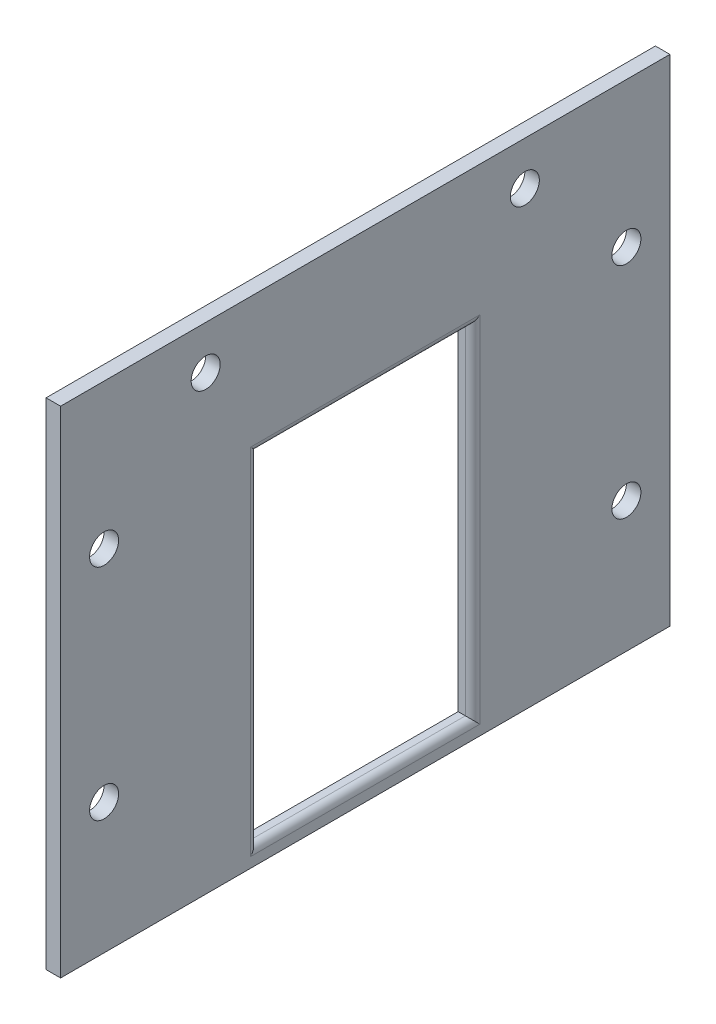
ISO-10303-21;
HEADER;
FILE_DESCRIPTION(('STEP AP214'),'2;1');
FILE_NAME('part.step','',(''),(''),'','','');
FILE_SCHEMA(('AUTOMOTIVE_DESIGN { 1 0 10303 214 1 1 1 1 }'));
ENDSEC;
DATA;
#1=APPLICATION_CONTEXT('core data for automotive mechanical design processes');
#2=APPLICATION_PROTOCOL_DEFINITION('international standard','automotive_design',2000,#1);
#3=PRODUCT_CONTEXT('',#1,'mechanical');
#4=PRODUCT('Part','Part','',(#3));
#5=PRODUCT_RELATED_PRODUCT_CATEGORY('part','',(#4));
#6=PRODUCT_DEFINITION_FORMATION('','',#4);
#7=PRODUCT_DEFINITION_CONTEXT('part definition',#1,'design');
#8=PRODUCT_DEFINITION('design','',#6,#7);
#9=PRODUCT_DEFINITION_SHAPE('','',#8);
#10=(LENGTH_UNIT() NAMED_UNIT(*) SI_UNIT(.MILLI.,.METRE.));
#11=(NAMED_UNIT(*) PLANE_ANGLE_UNIT() SI_UNIT($,.RADIAN.));
#12=(NAMED_UNIT(*) SI_UNIT($,.STERADIAN.) SOLID_ANGLE_UNIT());
#13=UNCERTAINTY_MEASURE_WITH_UNIT(LENGTH_MEASURE(1.E-05),#10,'distance_accuracy_value','');
#14=(GEOMETRIC_REPRESENTATION_CONTEXT(3) GLOBAL_UNCERTAINTY_ASSIGNED_CONTEXT((#13)) GLOBAL_UNIT_ASSIGNED_CONTEXT((#10,
#11,#12)) REPRESENTATION_CONTEXT('',''));
#15=CARTESIAN_POINT('',(0.,0.,0.));
#16=DIRECTION('',(0.,0.,1.));
#17=DIRECTION('',(1.,0.,0.));
#18=AXIS2_PLACEMENT_3D('',#15,#16,#17);
#19=CARTESIAN_POINT('',(-3.175,0.,0.));
#20=DIRECTION('',(-1.,0.,0.));
#21=DIRECTION('',(0.,0.,1.));
#22=AXIS2_PLACEMENT_3D('',#19,#20,#21);
#23=PLANE('',#22);
#24=CARTESIAN_POINT('',(-3.17500000000003,-60.325,-57.15));
#25=DIRECTION('',(1.,0.,0.));
#26=DIRECTION('',(0.,0.,1.));
#27=AXIS2_PLACEMENT_3D('',#24,#25,#26);
#28=CIRCLE('',#27,3.17499999999999);
#29=CARTESIAN_POINT('',(-3.17500000000003,-60.325,-53.975));
#30=VERTEX_POINT('',#29);
#31=EDGE_CURVE('E525',#30,#30,#28,.T.);
#32=ORIENTED_EDGE('',*,*,#31,.T.);
#33=EDGE_LOOP('',(#32));
#34=FACE_BOUND('',#33,.T.);
#35=CARTESIAN_POINT('',(-3.17500000000003,-12.275000088,-57.15));
#36=DIRECTION('',(1.,0.,0.));
#37=DIRECTION('',(0.,0.,1.));
#38=AXIS2_PLACEMENT_3D('',#35,#36,#37);
#39=CIRCLE('',#38,3.17499999999999);
#40=CARTESIAN_POINT('',(-3.17500000000003,-12.275000088,-53.975));
#41=VERTEX_POINT('',#40);
#42=EDGE_CURVE('E530',#41,#41,#39,.T.);
#43=ORIENTED_EDGE('',*,*,#42,.T.);
#44=EDGE_LOOP('',(#43));
#45=FACE_BOUND('',#44,.T.);
#46=CARTESIAN_POINT('',(-3.17500000000003,9.94999991199999,-34.925));
#47=DIRECTION('',(1.,0.,0.));
#48=DIRECTION('',(0.,0.,1.));
#49=AXIS2_PLACEMENT_3D('',#46,#47,#48);
#50=CIRCLE('',#49,3.175);
#51=CARTESIAN_POINT('',(-3.17500000000003,9.94999991199999,-31.75));
#52=VERTEX_POINT('',#51);
#53=EDGE_CURVE('E570',#52,#52,#50,.T.);
#54=ORIENTED_EDGE('',*,*,#53,.T.);
#55=EDGE_LOOP('',(#54));
#56=FACE_BOUND('',#55,.T.);
#57=CARTESIAN_POINT('',(-3.17500000000003,9.94999991199998,34.925));
#58=DIRECTION('',(1.,0.,0.));
#59=DIRECTION('',(0.,0.,-1.));
#60=AXIS2_PLACEMENT_3D('',#57,#58,#59);
#61=CIRCLE('',#60,3.175);
#62=CARTESIAN_POINT('',(-3.17500000000003,9.94999991199998,31.75));
#63=VERTEX_POINT('',#62);
#64=EDGE_CURVE('E562',#63,#63,#61,.T.);
#65=ORIENTED_EDGE('',*,*,#64,.T.);
#66=EDGE_LOOP('',(#65));
#67=FACE_BOUND('',#66,.T.);
#68=CARTESIAN_POINT('',(-3.17500000000003,-12.275000088,57.15));
#69=DIRECTION('',(1.,0.,0.));
#70=DIRECTION('',(0.,0.,-1.));
#71=AXIS2_PLACEMENT_3D('',#68,#69,#70);
#72=CIRCLE('',#71,3.175);
#73=CARTESIAN_POINT('',(-3.17500000000003,-12.275000088,53.975));
#74=VERTEX_POINT('',#73);
#75=EDGE_CURVE('E550',#74,#74,#72,.T.);
#76=ORIENTED_EDGE('',*,*,#75,.T.);
#77=EDGE_LOOP('',(#76));
#78=FACE_BOUND('',#77,.T.);
#79=CARTESIAN_POINT('',(-3.17500000000003,-60.325,57.15));
#80=DIRECTION('',(1.,0.,0.));
#81=DIRECTION('',(0.,0.,-1.));
#82=AXIS2_PLACEMENT_3D('',#79,#80,#81);
#83=CIRCLE('',#82,3.175);
#84=CARTESIAN_POINT('',(-3.17500000000003,-60.325,53.975));
#85=VERTEX_POINT('',#84);
#86=EDGE_CURVE('E237',#85,#85,#83,.T.);
#87=ORIENTED_EDGE('',*,*,#86,.T.);
#88=EDGE_LOOP('',(#87));
#89=FACE_BOUND('',#88,.T.);
#90=DIRECTION('',(0.,0.,-1.));
#91=VECTOR('',#90,1.);
#92=CARTESIAN_POINT('',(-3.175,19.474999912,63.5));
#93=LINE('',#92,#91);
#94=CARTESIAN_POINT('',(-3.17500000000003,19.474999912,66.675));
#95=VERTEX_POINT('',#94);
#96=CARTESIAN_POINT('',(-3.175,19.474999912,-66.675));
#97=VERTEX_POINT('',#96);
#98=EDGE_CURVE('E200',#95,#97,#93,.T.);
#99=ORIENTED_EDGE('',*,*,#98,.T.);
#100=DIRECTION('',(0.,1.,0.));
#101=VECTOR('',#100,1.);
#102=CARTESIAN_POINT('',(-3.175,-88.9,-66.675));
#103=LINE('',#102,#101);
#104=CARTESIAN_POINT('',(-3.17500000000003,-88.9,-66.675));
#105=VERTEX_POINT('',#104);
#106=EDGE_CURVE('E173',#105,#97,#103,.T.);
#107=ORIENTED_EDGE('',*,*,#106,.F.);
#108=DIRECTION('',(0.,0.,-1.));
#109=VECTOR('',#108,1.);
#110=CARTESIAN_POINT('',(-3.175,-88.9,63.5));
#111=LINE('',#110,#109);
#112=CARTESIAN_POINT('',(-3.175,-88.9,66.675));
#113=VERTEX_POINT('',#112);
#114=EDGE_CURVE('E206',#113,#105,#111,.T.);
#115=ORIENTED_EDGE('',*,*,#114,.F.);
#116=DIRECTION('',(0.,-1.,0.));
#117=VECTOR('',#116,1.);
#118=CARTESIAN_POINT('',(-3.175,19.474999912,66.675));
#119=LINE('',#118,#117);
#120=EDGE_CURVE('E188',#95,#113,#119,.T.);
#121=ORIENTED_EDGE('',*,*,#120,.F.);
#122=EDGE_LOOP('',(#99,#107,#115,#121));
#123=FACE_BOUND('',#122,.T.);
#124=DIRECTION('',(0.,1.,0.));
#125=VECTOR('',#124,1.);
#126=CARTESIAN_POINT('',(-3.17500000000003,0.,-23.495));
#127=LINE('',#126,#125);
#128=CARTESIAN_POINT('',(-3.17500000000003,-85.09,-23.495));
#129=VERTEX_POINT('',#128);
#130=CARTESIAN_POINT('',(-3.17500000000003,-10.668,-23.495));
#131=VERTEX_POINT('',#130);
#132=EDGE_CURVE('E141',#129,#131,#127,.T.);
#133=ORIENTED_EDGE('',*,*,#132,.T.);
#134=DIRECTION('',(0.,0.,-1.));
#135=VECTOR('',#134,1.);
#136=CARTESIAN_POINT('',(-3.17500000000003,-10.668,0.));
#137=LINE('',#136,#135);
#138=CARTESIAN_POINT('',(-3.17500000000003,-10.668,23.495));
#139=VERTEX_POINT('',#138);
#140=EDGE_CURVE('E136',#139,#131,#137,.T.);
#141=ORIENTED_EDGE('',*,*,#140,.F.);
#142=DIRECTION('',(0.,1.,0.));
#143=VECTOR('',#142,1.);
#144=CARTESIAN_POINT('',(-3.17500000000003,0.,23.495));
#145=LINE('',#144,#143);
#146=CARTESIAN_POINT('',(-3.175,-85.09,23.495));
#147=VERTEX_POINT('',#146);
#148=EDGE_CURVE('E126',#147,#139,#145,.T.);
#149=ORIENTED_EDGE('',*,*,#148,.F.);
#150=DIRECTION('',(0.,0.,1.));
#151=VECTOR('',#150,1.);
#152=CARTESIAN_POINT('',(-3.17500000000003,-85.09,0.));
#153=LINE('',#152,#151);
#154=EDGE_CURVE('E135',#129,#147,#153,.T.);
#155=ORIENTED_EDGE('',*,*,#154,.F.);
#156=EDGE_LOOP('',(#133,#141,#149,#155));
#157=FACE_BOUND('',#156,.T.);
#158=ADVANCED_FACE('F49',(#34,#45,#56,#67,#78,#89,#123,#157),#23,.T.);
#159=CARTESIAN_POINT('',(0.,0.,0.));
#160=DIRECTION('',(-1.,0.,0.));
#161=DIRECTION('',(0.,0.,1.));
#162=AXIS2_PLACEMENT_3D('',#159,#160,#161);
#163=PLANE('',#162);
#164=CARTESIAN_POINT('',(0.,-60.325,-57.15));
#165=DIRECTION('',(1.,0.,0.));
#166=DIRECTION('',(0.,0.,1.));
#167=AXIS2_PLACEMENT_3D('',#164,#165,#166);
#168=CIRCLE('',#167,3.17499999999999);
#169=CARTESIAN_POINT('',(0.,-60.325,-53.975));
#170=VERTEX_POINT('',#169);
#171=EDGE_CURVE('E528',#170,#170,#168,.T.);
#172=ORIENTED_EDGE('',*,*,#171,.F.);
#173=EDGE_LOOP('',(#172));
#174=FACE_BOUND('',#173,.T.);
#175=CARTESIAN_POINT('',(0.,-12.275000088,-57.15));
#176=DIRECTION('',(1.,0.,0.));
#177=DIRECTION('',(0.,0.,1.));
#178=AXIS2_PLACEMENT_3D('',#175,#176,#177);
#179=CIRCLE('',#178,3.17499999999999);
#180=CARTESIAN_POINT('',(0.,-12.275000088,-53.975));
#181=VERTEX_POINT('',#180);
#182=EDGE_CURVE('E535',#181,#181,#179,.T.);
#183=ORIENTED_EDGE('',*,*,#182,.F.);
#184=EDGE_LOOP('',(#183));
#185=FACE_BOUND('',#184,.T.);
#186=CARTESIAN_POINT('',(0.,9.94999991199999,-34.925));
#187=DIRECTION('',(1.,0.,0.));
#188=DIRECTION('',(0.,0.,1.));
#189=AXIS2_PLACEMENT_3D('',#186,#187,#188);
#190=CIRCLE('',#189,3.175);
#191=CARTESIAN_POINT('',(0.,9.94999991199999,-31.75));
#192=VERTEX_POINT('',#191);
#193=EDGE_CURVE('E566',#192,#192,#190,.T.);
#194=ORIENTED_EDGE('',*,*,#193,.F.);
#195=EDGE_LOOP('',(#194));
#196=FACE_BOUND('',#195,.T.);
#197=CARTESIAN_POINT('',(0.,9.94999991199998,34.925));
#198=DIRECTION('',(1.,0.,0.));
#199=DIRECTION('',(0.,0.,-1.));
#200=AXIS2_PLACEMENT_3D('',#197,#198,#199);
#201=CIRCLE('',#200,3.175);
#202=CARTESIAN_POINT('',(0.,9.94999991199998,31.75));
#203=VERTEX_POINT('',#202);
#204=EDGE_CURVE('E556',#203,#203,#201,.T.);
#205=ORIENTED_EDGE('',*,*,#204,.F.);
#206=EDGE_LOOP('',(#205));
#207=FACE_BOUND('',#206,.T.);
#208=CARTESIAN_POINT('',(0.,-12.275000088,57.15));
#209=DIRECTION('',(1.,0.,0.));
#210=DIRECTION('',(0.,0.,-1.));
#211=AXIS2_PLACEMENT_3D('',#208,#209,#210);
#212=CIRCLE('',#211,3.175);
#213=CARTESIAN_POINT('',(0.,-12.275000088,53.975));
#214=VERTEX_POINT('',#213);
#215=EDGE_CURVE('E545',#214,#214,#212,.T.);
#216=ORIENTED_EDGE('',*,*,#215,.F.);
#217=EDGE_LOOP('',(#216));
#218=FACE_BOUND('',#217,.T.);
#219=CARTESIAN_POINT('',(0.,-60.325,57.15));
#220=DIRECTION('',(1.,0.,0.));
#221=DIRECTION('',(0.,0.,-1.));
#222=AXIS2_PLACEMENT_3D('',#219,#220,#221);
#223=CIRCLE('',#222,3.175);
#224=CARTESIAN_POINT('',(0.,-60.325,53.975));
#225=VERTEX_POINT('',#224);
#226=EDGE_CURVE('E151',#225,#225,#223,.T.);
#227=ORIENTED_EDGE('',*,*,#226,.F.);
#228=EDGE_LOOP('',(#227));
#229=FACE_BOUND('',#228,.T.);
#230=DIRECTION('',(0.,0.,-1.));
#231=VECTOR('',#230,1.);
#232=CARTESIAN_POINT('',(0.,-9.08050000000001,-23.495));
#233=LINE('',#232,#231);
#234=CARTESIAN_POINT('',(0.,-9.08050000000001,25.0825));
#235=VERTEX_POINT('',#234);
#236=CARTESIAN_POINT('',(0.,-9.08050000000001,-25.0825));
#237=VERTEX_POINT('',#236);
#238=EDGE_CURVE('E218',#235,#237,#233,.T.);
#239=ORIENTED_EDGE('',*,*,#238,.T.);
#240=DIRECTION('',(0.,1.,0.));
#241=VECTOR('',#240,1.);
#242=CARTESIAN_POINT('',(0.,0.,-25.0825));
#243=LINE('',#242,#241);
#244=CARTESIAN_POINT('',(0.,-86.6775,-25.0825));
#245=VERTEX_POINT('',#244);
#246=EDGE_CURVE('E224',#237,#245,#243,.F.);
#247=ORIENTED_EDGE('',*,*,#246,.T.);
#248=DIRECTION('',(0.,0.,1.));
#249=VECTOR('',#248,1.);
#250=CARTESIAN_POINT('',(0.,-86.6775,23.495));
#251=LINE('',#250,#249);
#252=CARTESIAN_POINT('',(0.,-86.6775,25.0825));
#253=VERTEX_POINT('',#252);
#254=EDGE_CURVE('E221',#245,#253,#251,.T.);
#255=ORIENTED_EDGE('',*,*,#254,.T.);
#256=DIRECTION('',(0.,1.,0.));
#257=VECTOR('',#256,1.);
#258=CARTESIAN_POINT('',(0.,-10.668,25.0825));
#259=LINE('',#258,#257);
#260=EDGE_CURVE('E215',#253,#235,#259,.T.);
#261=ORIENTED_EDGE('',*,*,#260,.T.);
#262=EDGE_LOOP('',(#239,#247,#255,#261));
#263=FACE_BOUND('',#262,.T.);
#264=DIRECTION('',(0.,0.,-1.));
#265=VECTOR('',#264,1.);
#266=CARTESIAN_POINT('',(0.,-88.9,63.5));
#267=LINE('',#266,#265);
#268=CARTESIAN_POINT('',(0.,-88.9,66.675));
#269=VERTEX_POINT('',#268);
#270=CARTESIAN_POINT('',(0.,-88.9,-66.675));
#271=VERTEX_POINT('',#270);
#272=EDGE_CURVE('E203',#269,#271,#267,.T.);
#273=ORIENTED_EDGE('',*,*,#272,.T.);
#274=DIRECTION('',(0.,1.,0.));
#275=VECTOR('',#274,1.);
#276=CARTESIAN_POINT('',(0.,-88.9,-66.675));
#277=LINE('',#276,#275);
#278=CARTESIAN_POINT('',(0.,19.474999912,-66.675));
#279=VERTEX_POINT('',#278);
#280=EDGE_CURVE('E172',#271,#279,#277,.T.);
#281=ORIENTED_EDGE('',*,*,#280,.T.);
#282=DIRECTION('',(0.,0.,-1.));
#283=VECTOR('',#282,1.);
#284=CARTESIAN_POINT('',(0.,19.474999912,63.5));
#285=LINE('',#284,#283);
#286=CARTESIAN_POINT('',(0.,19.474999912,66.675));
#287=VERTEX_POINT('',#286);
#288=EDGE_CURVE('E196',#287,#279,#285,.T.);
#289=ORIENTED_EDGE('',*,*,#288,.F.);
#290=DIRECTION('',(0.,-1.,0.));
#291=VECTOR('',#290,1.);
#292=CARTESIAN_POINT('',(0.,19.474999912,66.675));
#293=LINE('',#292,#291);
#294=EDGE_CURVE('E183',#287,#269,#293,.T.);
#295=ORIENTED_EDGE('',*,*,#294,.T.);
#296=EDGE_LOOP('',(#273,#281,#289,#295));
#297=FACE_BOUND('',#296,.T.);
#298=ADVANCED_FACE('F263',(#174,#185,#196,#207,#218,#229,#263,#297),#163,.F.);
#299=CARTESIAN_POINT('',(-3.175,-88.9,63.5));
#300=DIRECTION('',(0.,-1.,0.));
#301=DIRECTION('',(0.,0.,-1.));
#302=AXIS2_PLACEMENT_3D('',#299,#300,#301);
#303=PLANE('',#302);
#304=ORIENTED_EDGE('',*,*,#272,.F.);
#305=DIRECTION('',(1.,0.,0.));
#306=VECTOR('',#305,1.);
#307=CARTESIAN_POINT('',(-111.596498010893,-88.9,66.675));
#308=LINE('',#307,#306);
#309=EDGE_CURVE('E192',#113,#269,#308,.T.);
#310=ORIENTED_EDGE('',*,*,#309,.F.);
#311=ORIENTED_EDGE('',*,*,#114,.T.);
#312=DIRECTION('',(1.,0.,0.));
#313=VECTOR('',#312,1.);
#314=CARTESIAN_POINT('',(-111.596498010893,-88.9,-66.675));
#315=LINE('',#314,#313);
#316=EDGE_CURVE('E168',#105,#271,#315,.T.);
#317=ORIENTED_EDGE('',*,*,#316,.T.);
#318=EDGE_LOOP('',(#304,#310,#311,#317));
#319=FACE_BOUND('',#318,.T.);
#320=ADVANCED_FACE('F266',(#319),#303,.T.);
#321=CARTESIAN_POINT('',(-3.175,19.474999912,63.5));
#322=DIRECTION('',(0.,-1.,0.));
#323=DIRECTION('',(0.,0.,-1.));
#324=AXIS2_PLACEMENT_3D('',#321,#322,#323);
#325=PLANE('',#324);
#326=ORIENTED_EDGE('',*,*,#288,.T.);
#327=DIRECTION('',(1.,0.,0.));
#328=VECTOR('',#327,1.);
#329=CARTESIAN_POINT('',(-111.596498010893,19.474999912,-66.675));
#330=LINE('',#329,#328);
#331=EDGE_CURVE('E161',#97,#279,#330,.T.);
#332=ORIENTED_EDGE('',*,*,#331,.F.);
#333=ORIENTED_EDGE('',*,*,#98,.F.);
#334=DIRECTION('',(1.,0.,0.));
#335=VECTOR('',#334,1.);
#336=CARTESIAN_POINT('',(-111.596498010893,19.474999912,66.675));
#337=LINE('',#336,#335);
#338=EDGE_CURVE('E187',#95,#287,#337,.T.);
#339=ORIENTED_EDGE('',*,*,#338,.T.);
#340=EDGE_LOOP('',(#326,#332,#333,#339));
#341=FACE_BOUND('',#340,.T.);
#342=ADVANCED_FACE('F279',(#341),#325,.F.);
#343=CARTESIAN_POINT('',(-111.596498010893,19.474999912,66.675));
#344=DIRECTION('',(0.,0.,1.));
#345=DIRECTION('',(0.,-1.,0.));
#346=AXIS2_PLACEMENT_3D('',#343,#344,#345);
#347=PLANE('',#346);
#348=ORIENTED_EDGE('',*,*,#338,.F.);
#349=ORIENTED_EDGE('',*,*,#120,.T.);
#350=ORIENTED_EDGE('',*,*,#309,.T.);
#351=ORIENTED_EDGE('',*,*,#294,.F.);
#352=EDGE_LOOP('',(#348,#349,#350,#351));
#353=FACE_BOUND('',#352,.T.);
#354=ADVANCED_FACE('F283',(#353),#347,.T.);
#355=CARTESIAN_POINT('',(-111.596498010893,-88.9,-66.675));
#356=DIRECTION('',(0.,0.,-1.));
#357=DIRECTION('',(-1.,0.,0.));
#358=AXIS2_PLACEMENT_3D('',#355,#356,#357);
#359=PLANE('',#358);
#360=ORIENTED_EDGE('',*,*,#316,.F.);
#361=ORIENTED_EDGE('',*,*,#106,.T.);
#362=ORIENTED_EDGE('',*,*,#331,.T.);
#363=ORIENTED_EDGE('',*,*,#280,.F.);
#364=EDGE_LOOP('',(#360,#361,#362,#363));
#365=FACE_BOUND('',#364,.T.);
#366=ADVANCED_FACE('F276',(#365),#359,.T.);
#367=CARTESIAN_POINT('',(-3.17500000000003,-10.668,0.));
#368=DIRECTION('',(0.,-1.,0.));
#369=DIRECTION('',(0.,0.,-1.));
#370=AXIS2_PLACEMENT_3D('',#367,#368,#369);
#371=PLANE('',#370);
#372=DIRECTION('',(1.,0.,0.));
#373=VECTOR('',#372,1.);
#374=CARTESIAN_POINT('',(-3.17500000000003,-10.668,-23.495));
#375=LINE('',#374,#373);
#376=CARTESIAN_POINT('',(-1.5875,-10.668,-23.495));
#377=VERTEX_POINT('',#376);
#378=EDGE_CURVE('E158',#131,#377,#375,.T.);
#379=ORIENTED_EDGE('',*,*,#378,.T.);
#380=DIRECTION('',(0.,0.,-1.));
#381=VECTOR('',#380,1.);
#382=CARTESIAN_POINT('',(-1.5875,-10.668,23.495));
#383=LINE('',#382,#381);
#384=CARTESIAN_POINT('',(-1.5875,-10.668,23.495));
#385=VERTEX_POINT('',#384);
#386=EDGE_CURVE('E59',#377,#385,#383,.F.);
#387=ORIENTED_EDGE('',*,*,#386,.T.);
#388=DIRECTION('',(1.,0.,0.));
#389=VECTOR('',#388,1.);
#390=CARTESIAN_POINT('',(-3.17500000000003,-10.668,23.495));
#391=LINE('',#390,#389);
#392=EDGE_CURVE('E128',#139,#385,#391,.T.);
#393=ORIENTED_EDGE('',*,*,#392,.F.);
#394=ORIENTED_EDGE('',*,*,#140,.T.);
#395=EDGE_LOOP('',(#379,#387,#393,#394));
#396=FACE_BOUND('',#395,.T.);
#397=ADVANCED_FACE('F138',(#396),#371,.T.);
#398=CARTESIAN_POINT('',(-3.17500000000003,0.,-23.495));
#399=DIRECTION('',(0.,0.,-1.));
#400=DIRECTION('',(-1.,0.,0.));
#401=AXIS2_PLACEMENT_3D('',#398,#399,#400);
#402=PLANE('',#401);
#403=DIRECTION('',(1.,0.,0.));
#404=VECTOR('',#403,1.);
#405=CARTESIAN_POINT('',(-3.17500000000003,-85.09,-23.495));
#406=LINE('',#405,#404);
#407=CARTESIAN_POINT('',(-1.5875,-85.09,-23.495));
#408=VERTEX_POINT('',#407);
#409=EDGE_CURVE('E162',#129,#408,#406,.T.);
#410=ORIENTED_EDGE('',*,*,#409,.T.);
#411=DIRECTION('',(0.,1.,0.));
#412=VECTOR('',#411,1.);
#413=CARTESIAN_POINT('',(-1.5875,0.,-23.495));
#414=LINE('',#413,#412);
#415=EDGE_CURVE('E209',#408,#377,#414,.T.);
#416=ORIENTED_EDGE('',*,*,#415,.T.);
#417=ORIENTED_EDGE('',*,*,#378,.F.);
#418=ORIENTED_EDGE('',*,*,#132,.F.);
#419=EDGE_LOOP('',(#410,#416,#417,#418));
#420=FACE_BOUND('',#419,.T.);
#421=ADVANCED_FACE('F258',(#420),#402,.F.);
#422=CARTESIAN_POINT('',(-3.17500000000003,-85.09,0.));
#423=DIRECTION('',(0.,1.,0.));
#424=DIRECTION('',(0.,0.,1.));
#425=AXIS2_PLACEMENT_3D('',#422,#423,#424);
#426=PLANE('',#425);
#427=DIRECTION('',(1.,0.,0.));
#428=VECTOR('',#427,1.);
#429=CARTESIAN_POINT('',(-3.17500000000003,-85.09,23.495));
#430=LINE('',#429,#428);
#431=CARTESIAN_POINT('',(-1.5875,-85.09,23.495));
#432=VERTEX_POINT('',#431);
#433=EDGE_CURVE('E129',#147,#432,#430,.T.);
#434=ORIENTED_EDGE('',*,*,#433,.T.);
#435=DIRECTION('',(0.,0.,1.));
#436=VECTOR('',#435,1.);
#437=CARTESIAN_POINT('',(-1.5875,-85.09,-23.495));
#438=LINE('',#437,#436);
#439=EDGE_CURVE('E228',#432,#408,#438,.F.);
#440=ORIENTED_EDGE('',*,*,#439,.T.);
#441=ORIENTED_EDGE('',*,*,#409,.F.);
#442=ORIENTED_EDGE('',*,*,#154,.T.);
#443=EDGE_LOOP('',(#434,#440,#441,#442));
#444=FACE_BOUND('',#443,.T.);
#445=ADVANCED_FACE('F256',(#444),#426,.T.);
#446=CARTESIAN_POINT('',(-3.17500000000003,0.,23.495));
#447=DIRECTION('',(0.,0.,-1.));
#448=DIRECTION('',(-1.,0.,0.));
#449=AXIS2_PLACEMENT_3D('',#446,#447,#448);
#450=PLANE('',#449);
#451=ORIENTED_EDGE('',*,*,#392,.T.);
#452=DIRECTION('',(0.,1.,0.));
#453=VECTOR('',#452,1.);
#454=CARTESIAN_POINT('',(-1.5875,-85.09,23.495));
#455=LINE('',#454,#453);
#456=EDGE_CURVE('E11',#385,#432,#455,.F.);
#457=ORIENTED_EDGE('',*,*,#456,.T.);
#458=ORIENTED_EDGE('',*,*,#433,.F.);
#459=ORIENTED_EDGE('',*,*,#148,.T.);
#460=EDGE_LOOP('',(#451,#457,#458,#459));
#461=FACE_BOUND('',#460,.T.);
#462=ADVANCED_FACE('F127',(#461),#450,.T.);
#463=CARTESIAN_POINT('',(-1.5875,0.,25.0825));
#464=DIRECTION('',(0.,-1.,0.));
#465=DIRECTION('',(0.,0.,-1.));
#466=AXIS2_PLACEMENT_3D('',#463,#464,#465);
#467=CYLINDRICAL_SURFACE('',#466,1.5875);
#468=CARTESIAN_POINT('',(-1.5875,-9.08050000000001,25.0825));
#469=DIRECTION('',(0.,-0.707106781186547,0.707106781186547));
#470=DIRECTION('',(0.,0.707106781186547,0.707106781186547));
#471=AXIS2_PLACEMENT_3D('',#468,#469,#470);
#472=ELLIPSE('',#471,2.24506403026729,1.5875);
#473=EDGE_CURVE('E149',#235,#385,#472,.F.);
#474=ORIENTED_EDGE('',*,*,#473,.F.);
#475=ORIENTED_EDGE('',*,*,#260,.F.);
#476=CARTESIAN_POINT('',(-1.5875,-86.6775,25.0825));
#477=DIRECTION('',(0.,-0.707106781186547,-0.707106781186547));
#478=DIRECTION('',(0.,0.707106781186547,-0.707106781186547));
#479=AXIS2_PLACEMENT_3D('',#476,#477,#478);
#480=ELLIPSE('',#479,2.24506403026729,1.5875);
#481=EDGE_CURVE('E53',#432,#253,#480,.T.);
#482=ORIENTED_EDGE('',*,*,#481,.F.);
#483=ORIENTED_EDGE('',*,*,#456,.F.);
#484=EDGE_LOOP('',(#474,#475,#482,#483));
#485=FACE_BOUND('',#484,.T.);
#486=ADVANCED_FACE('F51',(#485),#467,.T.);
#487=CARTESIAN_POINT('',(-1.5875,-86.6775,0.));
#488=DIRECTION('',(0.,0.,-1.));
#489=DIRECTION('',(-1.,0.,0.));
#490=AXIS2_PLACEMENT_3D('',#487,#488,#489);
#491=CYLINDRICAL_SURFACE('',#490,1.5875);
#492=ORIENTED_EDGE('',*,*,#481,.T.);
#493=ORIENTED_EDGE('',*,*,#254,.F.);
#494=CARTESIAN_POINT('',(-1.5875,-86.6775,-25.0825));
#495=DIRECTION('',(0.,0.707106781186547,-0.707106781186547));
#496=DIRECTION('',(0.,0.707106781186547,0.707106781186547));
#497=AXIS2_PLACEMENT_3D('',#494,#495,#496);
#498=ELLIPSE('',#497,2.24506403026729,1.5875);
#499=EDGE_CURVE('E236',#408,#245,#498,.T.);
#500=ORIENTED_EDGE('',*,*,#499,.F.);
#501=ORIENTED_EDGE('',*,*,#439,.F.);
#502=EDGE_LOOP('',(#492,#493,#500,#501));
#503=FACE_BOUND('',#502,.T.);
#504=ADVANCED_FACE('F253',(#503),#491,.T.);
#505=CARTESIAN_POINT('',(-1.5875,-9.08050000000001,0.));
#506=DIRECTION('',(0.,0.,1.));
#507=DIRECTION('',(1.,0.,0.));
#508=AXIS2_PLACEMENT_3D('',#505,#506,#507);
#509=CYLINDRICAL_SURFACE('',#508,1.5875);
#510=ORIENTED_EDGE('',*,*,#473,.T.);
#511=ORIENTED_EDGE('',*,*,#386,.F.);
#512=CARTESIAN_POINT('',(-1.5875,-9.08050000000001,-25.0825));
#513=DIRECTION('',(0.,0.707106781186547,0.707106781186547));
#514=DIRECTION('',(0.,0.707106781186547,-0.707106781186547));
#515=AXIS2_PLACEMENT_3D('',#512,#513,#514);
#516=ELLIPSE('',#515,2.24506403026729,1.5875);
#517=EDGE_CURVE('E233',#237,#377,#516,.F.);
#518=ORIENTED_EDGE('',*,*,#517,.F.);
#519=ORIENTED_EDGE('',*,*,#238,.F.);
#520=EDGE_LOOP('',(#510,#511,#518,#519));
#521=FACE_BOUND('',#520,.T.);
#522=ADVANCED_FACE('F244',(#521),#509,.T.);
#523=CARTESIAN_POINT('',(-1.5875,0.,-25.0825));
#524=DIRECTION('',(0.,1.,0.));
#525=DIRECTION('',(0.,0.,1.));
#526=AXIS2_PLACEMENT_3D('',#523,#524,#525);
#527=CYLINDRICAL_SURFACE('',#526,1.5875);
#528=ORIENTED_EDGE('',*,*,#499,.T.);
#529=ORIENTED_EDGE('',*,*,#246,.F.);
#530=ORIENTED_EDGE('',*,*,#517,.T.);
#531=ORIENTED_EDGE('',*,*,#415,.F.);
#532=EDGE_LOOP('',(#528,#529,#530,#531));
#533=FACE_BOUND('',#532,.T.);
#534=ADVANCED_FACE('F260',(#533),#527,.T.);
#535=CARTESIAN_POINT('',(-3.17500000000003,-60.325,57.15));
#536=DIRECTION('',(1.,0.,0.));
#537=DIRECTION('',(0.,0.,-1.));
#538=AXIS2_PLACEMENT_3D('',#535,#536,#537);
#539=CYLINDRICAL_SURFACE('',#538,3.175);
#540=ORIENTED_EDGE('',*,*,#86,.F.);
#541=EDGE_LOOP('',(#540));
#542=FACE_BOUND('',#541,.T.);
#543=ORIENTED_EDGE('',*,*,#226,.T.);
#544=EDGE_LOOP('',(#543));
#545=FACE_BOUND('',#544,.T.);
#546=ADVANCED_FACE('F299',(#542,#545),#539,.F.);
#547=CARTESIAN_POINT('',(-3.17500000000003,-12.275000088,57.15));
#548=DIRECTION('',(1.,0.,0.));
#549=DIRECTION('',(0.,0.,-1.));
#550=AXIS2_PLACEMENT_3D('',#547,#548,#549);
#551=CYLINDRICAL_SURFACE('',#550,3.175);
#552=ORIENTED_EDGE('',*,*,#75,.F.);
#553=EDGE_LOOP('',(#552));
#554=FACE_BOUND('',#553,.T.);
#555=ORIENTED_EDGE('',*,*,#215,.T.);
#556=EDGE_LOOP('',(#555));
#557=FACE_BOUND('',#556,.T.);
#558=ADVANCED_FACE('F401',(#554,#557),#551,.F.);
#559=CARTESIAN_POINT('',(-3.17500000000003,9.94999991199998,34.925));
#560=DIRECTION('',(1.,0.,0.));
#561=DIRECTION('',(0.,0.,-1.));
#562=AXIS2_PLACEMENT_3D('',#559,#560,#561);
#563=CYLINDRICAL_SURFACE('',#562,3.175);
#564=ORIENTED_EDGE('',*,*,#64,.F.);
#565=EDGE_LOOP('',(#564));
#566=FACE_BOUND('',#565,.T.);
#567=ORIENTED_EDGE('',*,*,#204,.T.);
#568=EDGE_LOOP('',(#567));
#569=FACE_BOUND('',#568,.T.);
#570=ADVANCED_FACE('F410',(#566,#569),#563,.F.);
#571=CARTESIAN_POINT('',(-3.17500000000003,9.94999991199999,-34.925));
#572=DIRECTION('',(1.,0.,0.));
#573=DIRECTION('',(0.,0.,-1.));
#574=AXIS2_PLACEMENT_3D('',#571,#572,#573);
#575=CYLINDRICAL_SURFACE('',#574,3.175);
#576=ORIENTED_EDGE('',*,*,#53,.F.);
#577=EDGE_LOOP('',(#576));
#578=FACE_BOUND('',#577,.T.);
#579=ORIENTED_EDGE('',*,*,#193,.T.);
#580=EDGE_LOOP('',(#579));
#581=FACE_BOUND('',#580,.T.);
#582=ADVANCED_FACE('F419',(#578,#581),#575,.F.);
#583=CARTESIAN_POINT('',(-3.17500000000003,-12.275000088,-57.15));
#584=DIRECTION('',(1.,0.,0.));
#585=DIRECTION('',(0.,0.,-1.));
#586=AXIS2_PLACEMENT_3D('',#583,#584,#585);
#587=CYLINDRICAL_SURFACE('',#586,3.17499999999999);
#588=ORIENTED_EDGE('',*,*,#42,.F.);
#589=EDGE_LOOP('',(#588));
#590=FACE_BOUND('',#589,.T.);
#591=ORIENTED_EDGE('',*,*,#182,.T.);
#592=EDGE_LOOP('',(#591));
#593=FACE_BOUND('',#592,.T.);
#594=ADVANCED_FACE('F428',(#590,#593),#587,.F.);
#595=CARTESIAN_POINT('',(-3.17500000000003,-60.325,-57.15));
#596=DIRECTION('',(1.,0.,0.));
#597=DIRECTION('',(0.,0.,-1.));
#598=AXIS2_PLACEMENT_3D('',#595,#596,#597);
#599=CYLINDRICAL_SURFACE('',#598,3.17499999999999);
#600=ORIENTED_EDGE('',*,*,#31,.F.);
#601=EDGE_LOOP('',(#600));
#602=FACE_BOUND('',#601,.T.);
#603=ORIENTED_EDGE('',*,*,#171,.T.);
#604=EDGE_LOOP('',(#603));
#605=FACE_BOUND('',#604,.T.);
#606=ADVANCED_FACE('F437',(#602,#605),#599,.F.);
#607=CLOSED_SHELL('',(#158,#298,#320,#342,#354,#366,#397,#421,#445,#462,#486,#504,#522,#534,
#546,#558,#570,#582,#594,#606));
#608=MANIFOLD_SOLID_BREP('B2',#607);
#609=ADVANCED_BREP_SHAPE_REPRESENTATION('',(#18,#608),#14);
#610=SHAPE_DEFINITION_REPRESENTATION(#9,#609);
ENDSEC;
END-ISO-10303-21;
